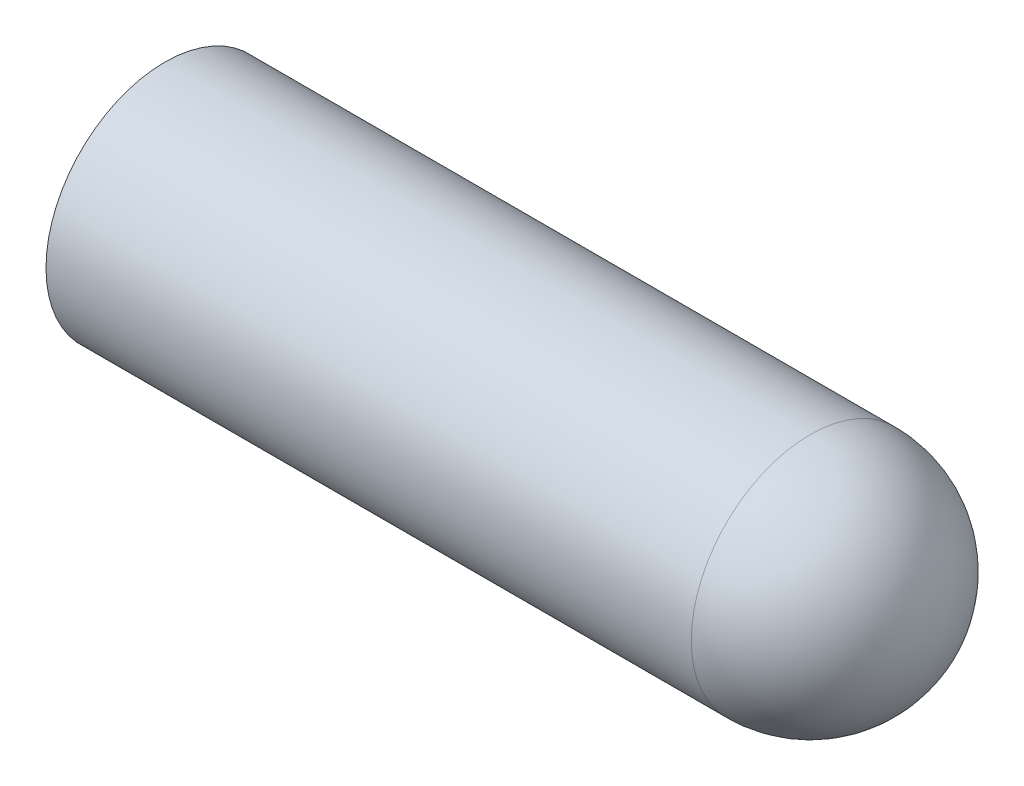
ISO-10303-21;
HEADER;
FILE_DESCRIPTION(('STEP AP214'),'2;1');
FILE_NAME('part.step','',(''),(''),'','','');
FILE_SCHEMA(('AUTOMOTIVE_DESIGN { 1 0 10303 214 1 1 1 1 }'));
ENDSEC;
DATA;
#1=APPLICATION_CONTEXT('core data for automotive mechanical design processes');
#2=APPLICATION_PROTOCOL_DEFINITION('international standard','automotive_design',2000,#1);
#3=PRODUCT_CONTEXT('',#1,'mechanical');
#4=PRODUCT('Part','Part','',(#3));
#5=PRODUCT_RELATED_PRODUCT_CATEGORY('part','',(#4));
#6=PRODUCT_DEFINITION_FORMATION('','',#4);
#7=PRODUCT_DEFINITION_CONTEXT('part definition',#1,'design');
#8=PRODUCT_DEFINITION('design','',#6,#7);
#9=PRODUCT_DEFINITION_SHAPE('','',#8);
#10=(LENGTH_UNIT() NAMED_UNIT(*) SI_UNIT(.MILLI.,.METRE.));
#11=(NAMED_UNIT(*) PLANE_ANGLE_UNIT() SI_UNIT($,.RADIAN.));
#12=(NAMED_UNIT(*) SI_UNIT($,.STERADIAN.) SOLID_ANGLE_UNIT());
#13=UNCERTAINTY_MEASURE_WITH_UNIT(LENGTH_MEASURE(1.E-05),#10,'distance_accuracy_value','');
#14=(GEOMETRIC_REPRESENTATION_CONTEXT(3) GLOBAL_UNCERTAINTY_ASSIGNED_CONTEXT((#13)) GLOBAL_UNIT_ASSIGNED_CONTEXT((#10,
#11,#12)) REPRESENTATION_CONTEXT('',''));
#15=CARTESIAN_POINT('',(0.,0.,0.));
#16=DIRECTION('',(0.,0.,1.));
#17=DIRECTION('',(1.,0.,0.));
#18=AXIS2_PLACEMENT_3D('',#15,#16,#17);
#19=CARTESIAN_POINT('',(0.,0.,0.));
#20=DIRECTION('',(1.,0.,0.));
#21=DIRECTION('',(0.,0.,-1.));
#22=AXIS2_PLACEMENT_3D('',#19,#20,#21);
#23=PLANE('',#22);
#24=CARTESIAN_POINT('',(0.,0.,0.));
#25=DIRECTION('',(-1.,0.,0.));
#26=DIRECTION('',(0.,0.,1.));
#27=AXIS2_PLACEMENT_3D('',#24,#25,#26);
#28=CIRCLE('',#27,1.6);
#29=CARTESIAN_POINT('',(0.,0.,1.6));
#30=VERTEX_POINT('',#29);
#31=EDGE_CURVE('E46',#30,#30,#28,.T.);
#32=ORIENTED_EDGE('',*,*,#31,.F.);
#33=EDGE_LOOP('',(#32));
#34=FACE_BOUND('',#33,.T.);
#35=CARTESIAN_POINT('',(0.,0.,0.));
#36=DIRECTION('',(-1.,0.,0.));
#37=DIRECTION('',(0.,0.,1.));
#38=AXIS2_PLACEMENT_3D('',#35,#36,#37);
#39=CIRCLE('',#38,7.);
#40=CARTESIAN_POINT('',(0.,0.,7.));
#41=VERTEX_POINT('',#40);
#42=EDGE_CURVE('E38',#41,#41,#39,.T.);
#43=ORIENTED_EDGE('',*,*,#42,.T.);
#44=EDGE_LOOP('',(#43));
#45=FACE_BOUND('',#44,.T.);
#46=ADVANCED_FACE('F32',(#34,#45),#23,.F.);
#47=CARTESIAN_POINT('',(38.,0.,0.));
#48=DIRECTION('',(-1.,0.,0.));
#49=DIRECTION('',(0.,1.,0.));
#50=AXIS2_PLACEMENT_3D('',#47,#48,#49);
#51=SPHERICAL_SURFACE('',#50,7.);
#52=CARTESIAN_POINT('',(38.,0.,0.));
#53=DIRECTION('',(-1.,0.,0.));
#54=DIRECTION('',(0.,0.,1.));
#55=AXIS2_PLACEMENT_3D('',#52,#53,#54);
#56=CIRCLE('',#55,7.);
#57=CARTESIAN_POINT('',(38.,0.,7.));
#58=VERTEX_POINT('',#57);
#59=EDGE_CURVE('E10',#58,#58,#56,.T.);
#60=ORIENTED_EDGE('',*,*,#59,.F.);
#61=EDGE_LOOP('',(#60));
#62=FACE_BOUND('',#61,.T.);
#63=ADVANCED_FACE('F55',(#62),#51,.T.);
#64=CARTESIAN_POINT('',(0.,0.,0.));
#65=DIRECTION('',(-1.,0.,0.));
#66=DIRECTION('',(0.,0.,1.));
#67=AXIS2_PLACEMENT_3D('',#64,#65,#66);
#68=CYLINDRICAL_SURFACE('',#67,7.);
#69=ORIENTED_EDGE('',*,*,#42,.F.);
#70=EDGE_LOOP('',(#69));
#71=FACE_BOUND('',#70,.T.);
#72=ORIENTED_EDGE('',*,*,#59,.T.);
#73=EDGE_LOOP('',(#72));
#74=FACE_BOUND('',#73,.T.);
#75=ADVANCED_FACE('F59',(#71,#74),#68,.T.);
#76=CARTESIAN_POINT('',(6.,0.,0.));
#77=DIRECTION('',(-1.,0.,0.));
#78=DIRECTION('',(0.,0.,1.));
#79=AXIS2_PLACEMENT_3D('',#76,#77,#78);
#80=CYLINDRICAL_SURFACE('',#79,1.6);
#81=CARTESIAN_POINT('',(6.,0.,0.));
#82=DIRECTION('',(-1.,0.,0.));
#83=DIRECTION('',(0.,0.,1.));
#84=AXIS2_PLACEMENT_3D('',#81,#82,#83);
#85=CIRCLE('',#84,1.6);
#86=CARTESIAN_POINT('',(6.,0.,1.6));
#87=VERTEX_POINT('',#86);
#88=EDGE_CURVE('E42',#87,#87,#85,.T.);
#89=ORIENTED_EDGE('',*,*,#88,.F.);
#90=EDGE_LOOP('',(#89));
#91=FACE_BOUND('',#90,.T.);
#92=ORIENTED_EDGE('',*,*,#31,.T.);
#93=EDGE_LOOP('',(#92));
#94=FACE_BOUND('',#93,.T.);
#95=ADVANCED_FACE('F52',(#91,#94),#80,.F.);
#96=CARTESIAN_POINT('',(6.,0.,0.));
#97=DIRECTION('',(-1.,0.,0.));
#98=DIRECTION('',(0.,0.,1.));
#99=AXIS2_PLACEMENT_3D('',#96,#97,#98);
#100=PLANE('',#99);
#101=ORIENTED_EDGE('',*,*,#88,.T.);
#102=EDGE_LOOP('',(#101));
#103=FACE_BOUND('',#102,.T.);
#104=ADVANCED_FACE('F69',(#103),#100,.T.);
#105=CLOSED_SHELL('',(#46,#63,#75,#95,#104));
#106=MANIFOLD_SOLID_BREP('B2',#105);
#107=ADVANCED_BREP_SHAPE_REPRESENTATION('',(#18,#106),#14);
#108=SHAPE_DEFINITION_REPRESENTATION(#9,#107);
ENDSEC;
END-ISO-10303-21;
